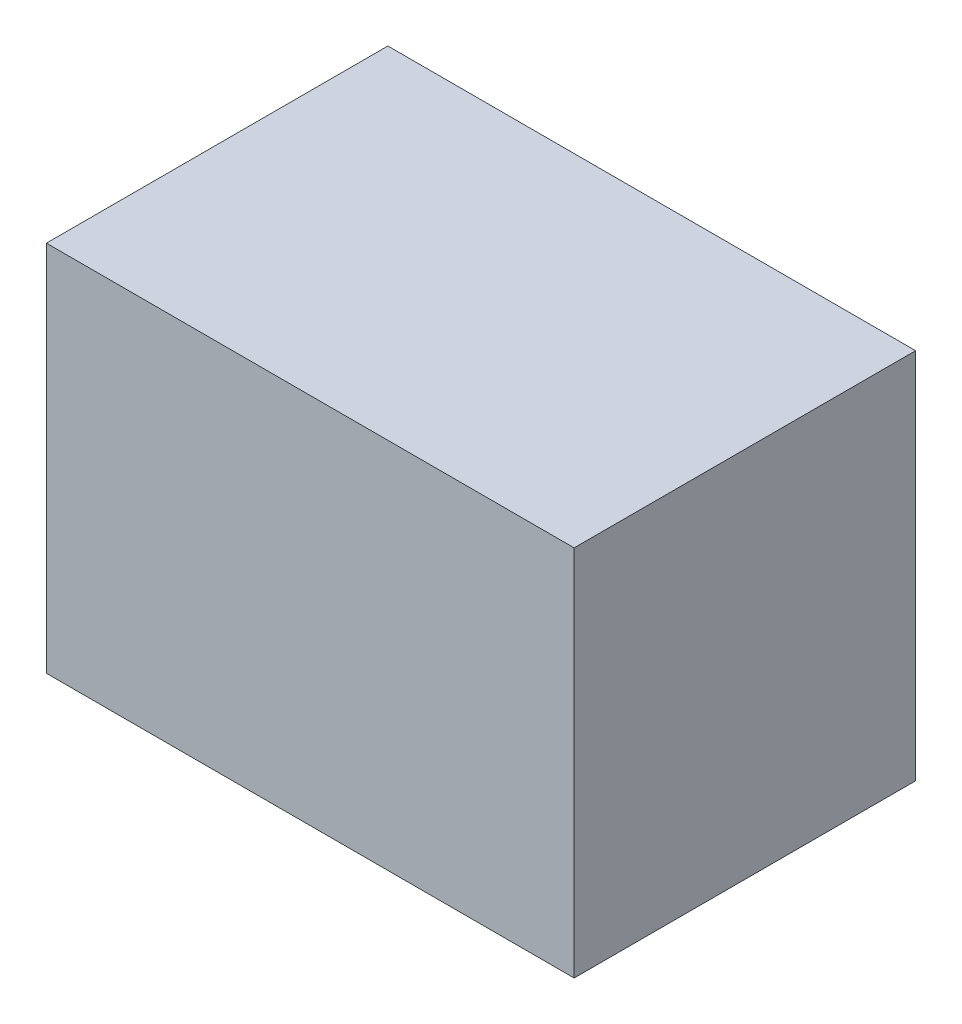
ISO-10303-21;
HEADER;
FILE_DESCRIPTION(('STEP AP214'),'2;1');
FILE_NAME('part.step','',(''),(''),'','','');
FILE_SCHEMA(('AUTOMOTIVE_DESIGN { 1 0 10303 214 1 1 1 1 }'));
ENDSEC;
DATA;
#1=APPLICATION_CONTEXT('core data for automotive mechanical design processes');
#2=APPLICATION_PROTOCOL_DEFINITION('international standard','automotive_design',2000,#1);
#3=PRODUCT_CONTEXT('',#1,'mechanical');
#4=PRODUCT('Part','Part','',(#3));
#5=PRODUCT_RELATED_PRODUCT_CATEGORY('part','',(#4));
#6=PRODUCT_DEFINITION_FORMATION('','',#4);
#7=PRODUCT_DEFINITION_CONTEXT('part definition',#1,'design');
#8=PRODUCT_DEFINITION('design','',#6,#7);
#9=PRODUCT_DEFINITION_SHAPE('','',#8);
#10=(LENGTH_UNIT() NAMED_UNIT(*) SI_UNIT(.MILLI.,.METRE.));
#11=(NAMED_UNIT(*) PLANE_ANGLE_UNIT() SI_UNIT($,.RADIAN.));
#12=(NAMED_UNIT(*) SI_UNIT($,.STERADIAN.) SOLID_ANGLE_UNIT());
#13=UNCERTAINTY_MEASURE_WITH_UNIT(LENGTH_MEASURE(1.E-05),#10,'distance_accuracy_value','');
#14=(GEOMETRIC_REPRESENTATION_CONTEXT(3) GLOBAL_UNCERTAINTY_ASSIGNED_CONTEXT((#13)) GLOBAL_UNIT_ASSIGNED_CONTEXT((#10,
#11,#12)) REPRESENTATION_CONTEXT('',''));
#15=CARTESIAN_POINT('',(0.,0.,0.));
#16=DIRECTION('',(0.,0.,1.));
#17=DIRECTION('',(1.,0.,0.));
#18=AXIS2_PLACEMENT_3D('',#15,#16,#17);
#19=CARTESIAN_POINT('',(26.9875,38.1,17.4625));
#20=DIRECTION('',(-1.,0.,0.));
#21=DIRECTION('',(0.,0.,1.));
#22=AXIS2_PLACEMENT_3D('',#19,#20,#21);
#23=PLANE('',#22);
#24=DIRECTION('',(0.,0.,-1.));
#25=VECTOR('',#24,1.);
#26=CARTESIAN_POINT('',(26.9875,0.,17.4625));
#27=LINE('',#26,#25);
#28=CARTESIAN_POINT('',(26.9875,0.,17.4625));
#29=VERTEX_POINT('',#28);
#30=CARTESIAN_POINT('',(26.9875,0.,-17.4625));
#31=VERTEX_POINT('',#30);
#32=EDGE_CURVE('E107',#29,#31,#27,.T.);
#33=ORIENTED_EDGE('',*,*,#32,.T.);
#34=DIRECTION('',(0.,-1.,0.));
#35=VECTOR('',#34,1.);
#36=CARTESIAN_POINT('',(26.9875,38.1,-17.4625));
#37=LINE('',#36,#35);
#38=CARTESIAN_POINT('',(26.9875,38.1,-17.4625));
#39=VERTEX_POINT('',#38);
#40=EDGE_CURVE('E11',#39,#31,#37,.T.);
#41=ORIENTED_EDGE('',*,*,#40,.F.);
#42=DIRECTION('',(0.,0.,-1.));
#43=VECTOR('',#42,1.);
#44=CARTESIAN_POINT('',(26.9875,38.1,17.4625));
#45=LINE('',#44,#43);
#46=CARTESIAN_POINT('',(26.9875,38.1,17.4625));
#47=VERTEX_POINT('',#46);
#48=EDGE_CURVE('E91',#47,#39,#45,.T.);
#49=ORIENTED_EDGE('',*,*,#48,.F.);
#50=DIRECTION('',(0.,-1.,0.));
#51=VECTOR('',#50,1.);
#52=CARTESIAN_POINT('',(26.9875,38.1,17.4625));
#53=LINE('',#52,#51);
#54=EDGE_CURVE('E103',#47,#29,#53,.T.);
#55=ORIENTED_EDGE('',*,*,#54,.T.);
#56=EDGE_LOOP('',(#33,#41,#49,#55));
#57=FACE_BOUND('',#56,.T.);
#58=ADVANCED_FACE('F39',(#57),#23,.F.);
#59=CARTESIAN_POINT('',(-26.9875,38.1,-17.4625));
#60=DIRECTION('',(0.,0.,1.));
#61=DIRECTION('',(1.,0.,0.));
#62=AXIS2_PLACEMENT_3D('',#59,#60,#61);
#63=PLANE('',#62);
#64=DIRECTION('',(-1.,0.,0.));
#65=VECTOR('',#64,1.);
#66=CARTESIAN_POINT('',(-26.9875,0.,-17.4625));
#67=LINE('',#66,#65);
#68=CARTESIAN_POINT('',(-26.9875,0.,-17.4625));
#69=VERTEX_POINT('',#68);
#70=EDGE_CURVE('E96',#31,#69,#67,.T.);
#71=ORIENTED_EDGE('',*,*,#70,.T.);
#72=DIRECTION('',(0.,-1.,0.));
#73=VECTOR('',#72,1.);
#74=CARTESIAN_POINT('',(-26.9875,38.1,-17.4625));
#75=LINE('',#74,#73);
#76=CARTESIAN_POINT('',(-26.9875,38.1,-17.4625));
#77=VERTEX_POINT('',#76);
#78=EDGE_CURVE('E48',#77,#69,#75,.T.);
#79=ORIENTED_EDGE('',*,*,#78,.F.);
#80=DIRECTION('',(-1.,0.,0.));
#81=VECTOR('',#80,1.);
#82=CARTESIAN_POINT('',(-26.9875,38.1,-17.4625));
#83=LINE('',#82,#81);
#84=EDGE_CURVE('E86',#39,#77,#83,.T.);
#85=ORIENTED_EDGE('',*,*,#84,.F.);
#86=ORIENTED_EDGE('',*,*,#40,.T.);
#87=EDGE_LOOP('',(#71,#79,#85,#86));
#88=FACE_BOUND('',#87,.T.);
#89=ADVANCED_FACE('F95',(#88),#63,.F.);
#90=CARTESIAN_POINT('',(-26.9875,38.1,17.4625));
#91=DIRECTION('',(1.,0.,0.));
#92=DIRECTION('',(0.,0.,-1.));
#93=AXIS2_PLACEMENT_3D('',#90,#91,#92);
#94=PLANE('',#93);
#95=DIRECTION('',(0.,0.,1.));
#96=VECTOR('',#95,1.);
#97=CARTESIAN_POINT('',(-26.9875,0.,17.4625));
#98=LINE('',#97,#96);
#99=CARTESIAN_POINT('',(-26.9875,0.,17.4625));
#100=VERTEX_POINT('',#99);
#101=EDGE_CURVE('E73',#69,#100,#98,.T.);
#102=ORIENTED_EDGE('',*,*,#101,.T.);
#103=DIRECTION('',(0.,-1.,0.));
#104=VECTOR('',#103,1.);
#105=CARTESIAN_POINT('',(-26.9875,38.1,17.4625));
#106=LINE('',#105,#104);
#107=CARTESIAN_POINT('',(-26.9875,38.1,17.4625));
#108=VERTEX_POINT('',#107);
#109=EDGE_CURVE('E98',#108,#100,#106,.T.);
#110=ORIENTED_EDGE('',*,*,#109,.F.);
#111=DIRECTION('',(0.,0.,1.));
#112=VECTOR('',#111,1.);
#113=CARTESIAN_POINT('',(-26.9875,38.1,17.4625));
#114=LINE('',#113,#112);
#115=EDGE_CURVE('E89',#77,#108,#114,.T.);
#116=ORIENTED_EDGE('',*,*,#115,.F.);
#117=ORIENTED_EDGE('',*,*,#78,.T.);
#118=EDGE_LOOP('',(#102,#110,#116,#117));
#119=FACE_BOUND('',#118,.T.);
#120=ADVANCED_FACE('F99',(#119),#94,.F.);
#121=CARTESIAN_POINT('',(-26.9875,38.1,17.4625));
#122=DIRECTION('',(0.,0.,-1.));
#123=DIRECTION('',(-1.,0.,0.));
#124=AXIS2_PLACEMENT_3D('',#121,#122,#123);
#125=PLANE('',#124);
#126=DIRECTION('',(1.,0.,0.));
#127=VECTOR('',#126,1.);
#128=CARTESIAN_POINT('',(-26.9875,0.,17.4625));
#129=LINE('',#128,#127);
#130=EDGE_CURVE('E79',#100,#29,#129,.T.);
#131=ORIENTED_EDGE('',*,*,#130,.T.);
#132=ORIENTED_EDGE('',*,*,#54,.F.);
#133=DIRECTION('',(1.,0.,0.));
#134=VECTOR('',#133,1.);
#135=CARTESIAN_POINT('',(-26.9875,38.1,17.4625));
#136=LINE('',#135,#134);
#137=EDGE_CURVE('E56',#108,#47,#136,.T.);
#138=ORIENTED_EDGE('',*,*,#137,.F.);
#139=ORIENTED_EDGE('',*,*,#109,.T.);
#140=EDGE_LOOP('',(#131,#132,#138,#139));
#141=FACE_BOUND('',#140,.T.);
#142=ADVANCED_FACE('F120',(#141),#125,.F.);
#143=CARTESIAN_POINT('',(0.,38.1,0.));
#144=DIRECTION('',(0.,-1.,0.));
#145=DIRECTION('',(0.,0.,-1.));
#146=AXIS2_PLACEMENT_3D('',#143,#144,#145);
#147=PLANE('',#146);
#148=ORIENTED_EDGE('',*,*,#48,.T.);
#149=ORIENTED_EDGE('',*,*,#84,.T.);
#150=ORIENTED_EDGE('',*,*,#115,.T.);
#151=ORIENTED_EDGE('',*,*,#137,.T.);
#152=EDGE_LOOP('',(#148,#149,#150,#151));
#153=FACE_BOUND('',#152,.T.);
#154=ADVANCED_FACE('F87',(#153),#147,.F.);
#155=CARTESIAN_POINT('',(0.,0.,0.));
#156=DIRECTION('',(0.,-1.,0.));
#157=DIRECTION('',(0.,0.,-1.));
#158=AXIS2_PLACEMENT_3D('',#155,#156,#157);
#159=PLANE('',#158);
#160=ORIENTED_EDGE('',*,*,#32,.F.);
#161=ORIENTED_EDGE('',*,*,#130,.F.);
#162=ORIENTED_EDGE('',*,*,#101,.F.);
#163=ORIENTED_EDGE('',*,*,#70,.F.);
#164=EDGE_LOOP('',(#160,#161,#162,#163));
#165=FACE_BOUND('',#164,.T.);
#166=ADVANCED_FACE('F123',(#165),#159,.T.);
#167=CLOSED_SHELL('',(#58,#89,#120,#142,#154,#166));
#168=MANIFOLD_SOLID_BREP('B2',#167);
#169=ADVANCED_BREP_SHAPE_REPRESENTATION('',(#18,#168),#14);
#170=SHAPE_DEFINITION_REPRESENTATION(#9,#169);
ENDSEC;
END-ISO-10303-21;
